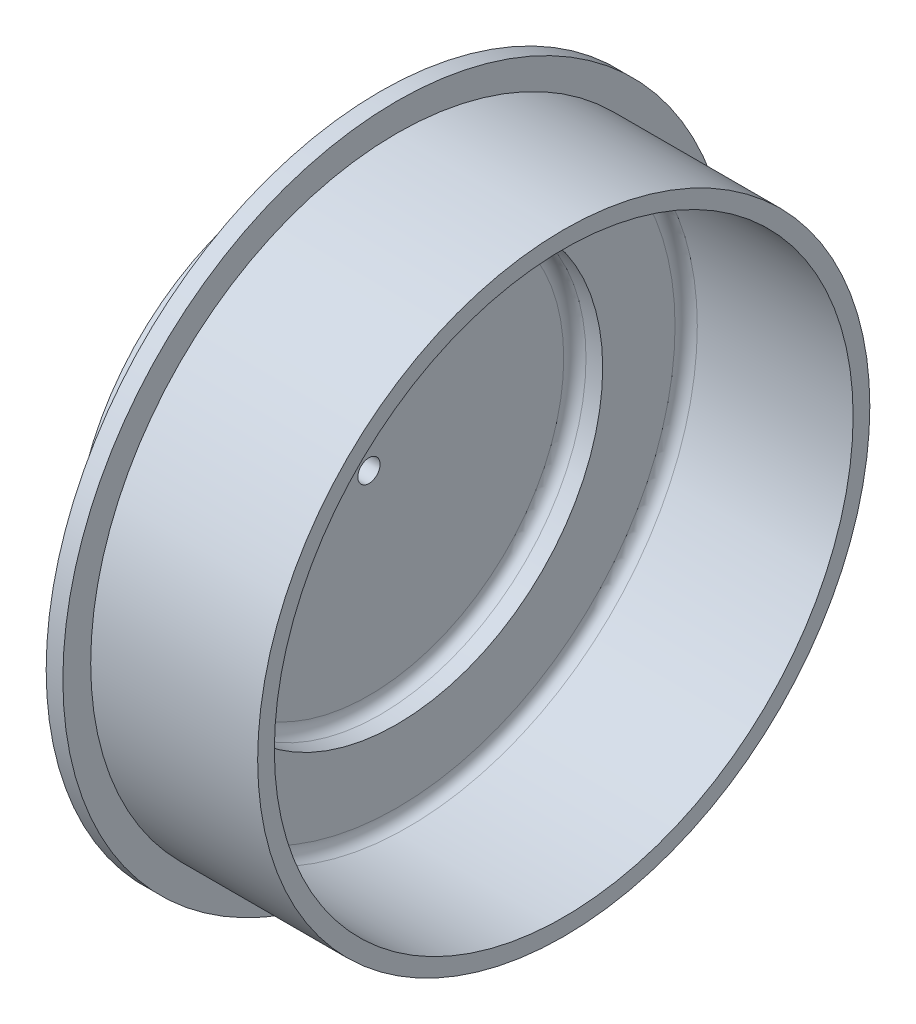
ISO-10303-21;
HEADER;
FILE_DESCRIPTION(('STEP AP214'),'2;1');
FILE_NAME('part.step','',(''),(''),'','','');
FILE_SCHEMA(('AUTOMOTIVE_DESIGN { 1 0 10303 214 1 1 1 1 }'));
ENDSEC;
DATA;
#1=APPLICATION_CONTEXT('core data for automotive mechanical design processes');
#2=APPLICATION_PROTOCOL_DEFINITION('international standard','automotive_design',2000,#1);
#3=PRODUCT_CONTEXT('',#1,'mechanical');
#4=PRODUCT('Part','Part','',(#3));
#5=PRODUCT_RELATED_PRODUCT_CATEGORY('part','',(#4));
#6=PRODUCT_DEFINITION_FORMATION('','',#4);
#7=PRODUCT_DEFINITION_CONTEXT('part definition',#1,'design');
#8=PRODUCT_DEFINITION('design','',#6,#7);
#9=PRODUCT_DEFINITION_SHAPE('','',#8);
#10=(LENGTH_UNIT() NAMED_UNIT(*) SI_UNIT(.MILLI.,.METRE.));
#11=(NAMED_UNIT(*) PLANE_ANGLE_UNIT() SI_UNIT($,.RADIAN.));
#12=(NAMED_UNIT(*) SI_UNIT($,.STERADIAN.) SOLID_ANGLE_UNIT());
#13=UNCERTAINTY_MEASURE_WITH_UNIT(LENGTH_MEASURE(1.E-05),#10,'distance_accuracy_value','');
#14=(GEOMETRIC_REPRESENTATION_CONTEXT(3) GLOBAL_UNCERTAINTY_ASSIGNED_CONTEXT((#13)) GLOBAL_UNIT_ASSIGNED_CONTEXT((#10,
#11,#12)) REPRESENTATION_CONTEXT('',''));
#15=CARTESIAN_POINT('',(0.,0.,0.));
#16=DIRECTION('',(0.,0.,1.));
#17=DIRECTION('',(1.,0.,0.));
#18=AXIS2_PLACEMENT_3D('',#15,#16,#17);
#19=CARTESIAN_POINT('',(0.,0.,0.));
#20=DIRECTION('',(-1.,0.,0.));
#21=DIRECTION('',(0.,0.,1.));
#22=AXIS2_PLACEMENT_3D('',#19,#20,#21);
#23=CYLINDRICAL_SURFACE('',#22,40.);
#24=CARTESIAN_POINT('',(0.,0.,0.));
#25=DIRECTION('',(-1.,0.,0.));
#26=DIRECTION('',(0.,0.,1.));
#27=AXIS2_PLACEMENT_3D('',#24,#25,#26);
#28=CIRCLE('',#27,40.);
#29=CARTESIAN_POINT('',(0.,0.,40.));
#30=VERTEX_POINT('',#29);
#31=EDGE_CURVE('E10',#30,#30,#28,.T.);
#32=ORIENTED_EDGE('',*,*,#31,.F.);
#33=EDGE_LOOP('',(#32));
#34=FACE_BOUND('',#33,.T.);
#35=CARTESIAN_POINT('',(15.,0.,0.));
#36=DIRECTION('',(-1.,0.,0.));
#37=DIRECTION('',(0.,0.,1.));
#38=AXIS2_PLACEMENT_3D('',#35,#36,#37);
#39=CIRCLE('',#38,40.);
#40=CARTESIAN_POINT('',(15.,0.,40.));
#41=VERTEX_POINT('',#40);
#42=EDGE_CURVE('E108',#41,#41,#39,.T.);
#43=ORIENTED_EDGE('',*,*,#42,.T.);
#44=EDGE_LOOP('',(#43));
#45=FACE_BOUND('',#44,.T.);
#46=ADVANCED_FACE('F37',(#34,#45),#23,.T.);
#47=CARTESIAN_POINT('',(0.,40.,0.));
#48=DIRECTION('',(1.,0.,0.));
#49=DIRECTION('',(0.,0.,-1.));
#50=AXIS2_PLACEMENT_3D('',#47,#48,#49);
#51=PLANE('',#50);
#52=CARTESIAN_POINT('',(0.,0.,0.));
#53=DIRECTION('',(-1.,0.,0.));
#54=DIRECTION('',(0.,0.,1.));
#55=AXIS2_PLACEMENT_3D('',#52,#53,#54);
#56=CIRCLE('',#55,37.);
#57=CARTESIAN_POINT('',(0.,0.,37.));
#58=VERTEX_POINT('',#57);
#59=EDGE_CURVE('E44',#58,#58,#56,.T.);
#60=ORIENTED_EDGE('',*,*,#59,.F.);
#61=EDGE_LOOP('',(#60));
#62=FACE_BOUND('',#61,.T.);
#63=ORIENTED_EDGE('',*,*,#31,.T.);
#64=EDGE_LOOP('',(#63));
#65=FACE_BOUND('',#64,.T.);
#66=ADVANCED_FACE('F200',(#62,#65),#51,.F.);
#67=CARTESIAN_POINT('',(0.,0.,0.));
#68=DIRECTION('',(-1.,0.,0.));
#69=DIRECTION('',(0.,0.,1.));
#70=AXIS2_PLACEMENT_3D('',#67,#68,#69);
#71=CYLINDRICAL_SURFACE('',#70,37.);
#72=CARTESIAN_POINT('',(8.,0.,0.));
#73=DIRECTION('',(-1.,0.,0.));
#74=DIRECTION('',(0.,0.,1.));
#75=AXIS2_PLACEMENT_3D('',#72,#73,#74);
#76=CIRCLE('',#75,37.);
#77=CARTESIAN_POINT('',(8.,0.,37.));
#78=VERTEX_POINT('',#77);
#79=EDGE_CURVE('E49',#78,#78,#76,.T.);
#80=ORIENTED_EDGE('',*,*,#79,.F.);
#81=EDGE_LOOP('',(#80));
#82=FACE_BOUND('',#81,.T.);
#83=ORIENTED_EDGE('',*,*,#59,.T.);
#84=EDGE_LOOP('',(#83));
#85=FACE_BOUND('',#84,.T.);
#86=ADVANCED_FACE('F195',(#82,#85),#71,.F.);
#87=CARTESIAN_POINT('',(8.,0.,0.));
#88=DIRECTION('',(-1.,0.,0.));
#89=DIRECTION('',(0.,0.,1.));
#90=AXIS2_PLACEMENT_3D('',#87,#88,#89);
#91=TOROIDAL_SURFACE('',#90,35.,2.);
#92=CARTESIAN_POINT('',(10.,0.,0.));
#93=DIRECTION('',(-1.,0.,0.));
#94=DIRECTION('',(0.,0.,1.));
#95=AXIS2_PLACEMENT_3D('',#92,#93,#94);
#96=CIRCLE('',#95,35.);
#97=CARTESIAN_POINT('',(10.,0.,35.));
#98=VERTEX_POINT('',#97);
#99=EDGE_CURVE('E54',#98,#98,#96,.T.);
#100=ORIENTED_EDGE('',*,*,#99,.F.);
#101=EDGE_LOOP('',(#100));
#102=FACE_BOUND('',#101,.T.);
#103=ORIENTED_EDGE('',*,*,#79,.T.);
#104=EDGE_LOOP('',(#103));
#105=FACE_BOUND('',#104,.T.);
#106=ADVANCED_FACE('F189',(#102,#105),#91,.F.);
#107=CARTESIAN_POINT('',(10.,35.,0.));
#108=DIRECTION('',(1.,0.,0.));
#109=DIRECTION('',(0.,0.,-1.));
#110=AXIS2_PLACEMENT_3D('',#107,#108,#109);
#111=PLANE('',#110);
#112=CARTESIAN_POINT('',(10.,0.,0.));
#113=DIRECTION('',(-1.,0.,0.));
#114=DIRECTION('',(0.,0.,1.));
#115=AXIS2_PLACEMENT_3D('',#112,#113,#114);
#116=CIRCLE('',#115,2.);
#117=CARTESIAN_POINT('',(10.,0.,2.));
#118=VERTEX_POINT('',#117);
#119=EDGE_CURVE('E60',#118,#118,#116,.T.);
#120=ORIENTED_EDGE('',*,*,#119,.F.);
#121=EDGE_LOOP('',(#120));
#122=FACE_BOUND('',#121,.T.);
#123=ORIENTED_EDGE('',*,*,#99,.T.);
#124=EDGE_LOOP('',(#123));
#125=FACE_BOUND('',#124,.T.);
#126=ADVANCED_FACE('F183',(#122,#125),#111,.F.);
#127=CARTESIAN_POINT('',(0.,0.,0.));
#128=DIRECTION('',(-1.,0.,0.));
#129=DIRECTION('',(0.,0.,1.));
#130=AXIS2_PLACEMENT_3D('',#127,#128,#129);
#131=CYLINDRICAL_SURFACE('',#130,2.);
#132=CARTESIAN_POINT('',(13.,0.,0.));
#133=DIRECTION('',(-1.,0.,0.));
#134=DIRECTION('',(0.,0.,1.));
#135=AXIS2_PLACEMENT_3D('',#132,#133,#134);
#136=CIRCLE('',#135,2.);
#137=CARTESIAN_POINT('',(13.,0.,2.));
#138=VERTEX_POINT('',#137);
#139=EDGE_CURVE('E64',#138,#138,#136,.T.);
#140=ORIENTED_EDGE('',*,*,#139,.F.);
#141=EDGE_LOOP('',(#140));
#142=FACE_BOUND('',#141,.T.);
#143=ORIENTED_EDGE('',*,*,#119,.T.);
#144=EDGE_LOOP('',(#143));
#145=FACE_BOUND('',#144,.T.);
#146=ADVANCED_FACE('F177',(#142,#145),#131,.F.);
#147=CARTESIAN_POINT('',(13.,2.,0.));
#148=DIRECTION('',(-1.,0.,0.));
#149=DIRECTION('',(0.,0.,1.));
#150=AXIS2_PLACEMENT_3D('',#147,#148,#149);
#151=PLANE('',#150);
#152=CARTESIAN_POINT('',(13.,0.,0.));
#153=DIRECTION('',(-1.,0.,0.));
#154=DIRECTION('',(0.,0.,1.));
#155=AXIS2_PLACEMENT_3D('',#152,#153,#154);
#156=CIRCLE('',#155,35.);
#157=CARTESIAN_POINT('',(13.,0.,35.));
#158=VERTEX_POINT('',#157);
#159=EDGE_CURVE('E68',#158,#158,#156,.T.);
#160=ORIENTED_EDGE('',*,*,#159,.F.);
#161=EDGE_LOOP('',(#160));
#162=FACE_BOUND('',#161,.T.);
#163=ORIENTED_EDGE('',*,*,#139,.T.);
#164=EDGE_LOOP('',(#163));
#165=FACE_BOUND('',#164,.T.);
#166=ADVANCED_FACE('F171',(#162,#165),#151,.F.);
#167=CARTESIAN_POINT('',(15.,0.,0.));
#168=DIRECTION('',(-1.,0.,0.));
#169=DIRECTION('',(0.,0.,1.));
#170=AXIS2_PLACEMENT_3D('',#167,#168,#169);
#171=TOROIDAL_SURFACE('',#170,35.,2.);
#172=CARTESIAN_POINT('',(15.,0.,0.));
#173=DIRECTION('',(-1.,0.,0.));
#174=DIRECTION('',(0.,0.,1.));
#175=AXIS2_PLACEMENT_3D('',#172,#173,#174);
#176=CIRCLE('',#175,37.);
#177=CARTESIAN_POINT('',(15.,0.,37.));
#178=VERTEX_POINT('',#177);
#179=EDGE_CURVE('E72',#178,#178,#176,.T.);
#180=ORIENTED_EDGE('',*,*,#179,.F.);
#181=EDGE_LOOP('',(#180));
#182=FACE_BOUND('',#181,.T.);
#183=ORIENTED_EDGE('',*,*,#159,.T.);
#184=EDGE_LOOP('',(#183));
#185=FACE_BOUND('',#184,.T.);
#186=ADVANCED_FACE('F165',(#182,#185),#171,.F.);
#187=CARTESIAN_POINT('',(0.,0.,0.));
#188=DIRECTION('',(-1.,0.,0.));
#189=DIRECTION('',(0.,0.,1.));
#190=AXIS2_PLACEMENT_3D('',#187,#188,#189);
#191=CYLINDRICAL_SURFACE('',#190,37.);
#192=CARTESIAN_POINT('',(18.,0.,0.));
#193=DIRECTION('',(-1.,0.,0.));
#194=DIRECTION('',(0.,0.,1.));
#195=AXIS2_PLACEMENT_3D('',#192,#193,#194);
#196=CIRCLE('',#195,37.);
#197=CARTESIAN_POINT('',(18.,0.,37.));
#198=VERTEX_POINT('',#197);
#199=EDGE_CURVE('E76',#198,#198,#196,.T.);
#200=ORIENTED_EDGE('',*,*,#199,.F.);
#201=EDGE_LOOP('',(#200));
#202=FACE_BOUND('',#201,.T.);
#203=ORIENTED_EDGE('',*,*,#179,.T.);
#204=EDGE_LOOP('',(#203));
#205=FACE_BOUND('',#204,.T.);
#206=ADVANCED_FACE('F159',(#202,#205),#191,.F.);
#207=CARTESIAN_POINT('',(18.,37.,0.));
#208=DIRECTION('',(-1.,0.,0.));
#209=DIRECTION('',(0.,0.,1.));
#210=AXIS2_PLACEMENT_3D('',#207,#208,#209);
#211=PLANE('',#210);
#212=CARTESIAN_POINT('',(18.,0.,0.));
#213=DIRECTION('',(-1.,0.,0.));
#214=DIRECTION('',(0.,0.,1.));
#215=AXIS2_PLACEMENT_3D('',#212,#213,#214);
#216=CIRCLE('',#215,50.);
#217=CARTESIAN_POINT('',(18.,0.,50.));
#218=VERTEX_POINT('',#217);
#219=EDGE_CURVE('E80',#218,#218,#216,.T.);
#220=ORIENTED_EDGE('',*,*,#219,.F.);
#221=EDGE_LOOP('',(#220));
#222=FACE_BOUND('',#221,.T.);
#223=ORIENTED_EDGE('',*,*,#199,.T.);
#224=EDGE_LOOP('',(#223));
#225=FACE_BOUND('',#224,.T.);
#226=ADVANCED_FACE('F153',(#222,#225),#211,.F.);
#227=CARTESIAN_POINT('',(20.,0.,0.));
#228=DIRECTION('',(-1.,0.,0.));
#229=DIRECTION('',(0.,0.,1.));
#230=AXIS2_PLACEMENT_3D('',#227,#228,#229);
#231=TOROIDAL_SURFACE('',#230,50.,2.);
#232=CARTESIAN_POINT('',(20.,0.,0.));
#233=DIRECTION('',(-1.,0.,0.));
#234=DIRECTION('',(0.,0.,1.));
#235=AXIS2_PLACEMENT_3D('',#232,#233,#234);
#236=CIRCLE('',#235,52.);
#237=CARTESIAN_POINT('',(20.,0.,52.));
#238=VERTEX_POINT('',#237);
#239=EDGE_CURVE('E84',#238,#238,#236,.T.);
#240=ORIENTED_EDGE('',*,*,#239,.F.);
#241=EDGE_LOOP('',(#240));
#242=FACE_BOUND('',#241,.T.);
#243=ORIENTED_EDGE('',*,*,#219,.T.);
#244=EDGE_LOOP('',(#243));
#245=FACE_BOUND('',#244,.T.);
#246=ADVANCED_FACE('F147',(#242,#245),#231,.F.);
#247=CARTESIAN_POINT('',(0.,0.,0.));
#248=DIRECTION('',(-1.,0.,0.));
#249=DIRECTION('',(0.,0.,1.));
#250=AXIS2_PLACEMENT_3D('',#247,#248,#249);
#251=CYLINDRICAL_SURFACE('',#250,52.);
#252=CARTESIAN_POINT('',(48.,0.,0.));
#253=DIRECTION('',(-1.,0.,0.));
#254=DIRECTION('',(0.,0.,1.));
#255=AXIS2_PLACEMENT_3D('',#252,#253,#254);
#256=CIRCLE('',#255,52.);
#257=CARTESIAN_POINT('',(48.,0.,52.));
#258=VERTEX_POINT('',#257);
#259=EDGE_CURVE('E88',#258,#258,#256,.T.);
#260=ORIENTED_EDGE('',*,*,#259,.F.);
#261=EDGE_LOOP('',(#260));
#262=FACE_BOUND('',#261,.T.);
#263=ORIENTED_EDGE('',*,*,#239,.T.);
#264=EDGE_LOOP('',(#263));
#265=FACE_BOUND('',#264,.T.);
#266=ADVANCED_FACE('F141',(#262,#265),#251,.F.);
#267=CARTESIAN_POINT('',(48.,52.,0.));
#268=DIRECTION('',(-1.,0.,0.));
#269=DIRECTION('',(0.,0.,1.));
#270=AXIS2_PLACEMENT_3D('',#267,#268,#269);
#271=PLANE('',#270);
#272=CARTESIAN_POINT('',(48.,0.,0.));
#273=DIRECTION('',(-1.,0.,0.));
#274=DIRECTION('',(0.,0.,1.));
#275=AXIS2_PLACEMENT_3D('',#272,#273,#274);
#276=CIRCLE('',#275,55.);
#277=CARTESIAN_POINT('',(48.,0.,55.));
#278=VERTEX_POINT('',#277);
#279=EDGE_CURVE('E92',#278,#278,#276,.T.);
#280=ORIENTED_EDGE('',*,*,#279,.F.);
#281=EDGE_LOOP('',(#280));
#282=FACE_BOUND('',#281,.T.);
#283=ORIENTED_EDGE('',*,*,#259,.T.);
#284=EDGE_LOOP('',(#283));
#285=FACE_BOUND('',#284,.T.);
#286=ADVANCED_FACE('F135',(#282,#285),#271,.F.);
#287=CARTESIAN_POINT('',(0.,0.,0.));
#288=DIRECTION('',(-1.,0.,0.));
#289=DIRECTION('',(0.,0.,1.));
#290=AXIS2_PLACEMENT_3D('',#287,#288,#289);
#291=CYLINDRICAL_SURFACE('',#290,55.);
#292=CARTESIAN_POINT('',(18.,0.,0.));
#293=DIRECTION('',(-1.,0.,0.));
#294=DIRECTION('',(0.,0.,1.));
#295=AXIS2_PLACEMENT_3D('',#292,#293,#294);
#296=CIRCLE('',#295,55.);
#297=CARTESIAN_POINT('',(18.,0.,55.));
#298=VERTEX_POINT('',#297);
#299=EDGE_CURVE('E96',#298,#298,#296,.T.);
#300=ORIENTED_EDGE('',*,*,#299,.F.);
#301=EDGE_LOOP('',(#300));
#302=FACE_BOUND('',#301,.T.);
#303=ORIENTED_EDGE('',*,*,#279,.T.);
#304=EDGE_LOOP('',(#303));
#305=FACE_BOUND('',#304,.T.);
#306=ADVANCED_FACE('F129',(#302,#305),#291,.T.);
#307=CARTESIAN_POINT('',(18.,55.,0.));
#308=DIRECTION('',(-1.,0.,0.));
#309=DIRECTION('',(0.,0.,1.));
#310=AXIS2_PLACEMENT_3D('',#307,#308,#309);
#311=PLANE('',#310);
#312=CARTESIAN_POINT('',(18.,0.,0.));
#313=DIRECTION('',(-1.,0.,0.));
#314=DIRECTION('',(0.,0.,1.));
#315=AXIS2_PLACEMENT_3D('',#312,#313,#314);
#316=CIRCLE('',#315,60.);
#317=CARTESIAN_POINT('',(18.,0.,60.));
#318=VERTEX_POINT('',#317);
#319=EDGE_CURVE('E100',#318,#318,#316,.T.);
#320=ORIENTED_EDGE('',*,*,#319,.F.);
#321=EDGE_LOOP('',(#320));
#322=FACE_BOUND('',#321,.T.);
#323=ORIENTED_EDGE('',*,*,#299,.T.);
#324=EDGE_LOOP('',(#323));
#325=FACE_BOUND('',#324,.T.);
#326=ADVANCED_FACE('F123',(#322,#325),#311,.F.);
#327=CARTESIAN_POINT('',(0.,0.,0.));
#328=DIRECTION('',(-1.,0.,0.));
#329=DIRECTION('',(0.,0.,1.));
#330=AXIS2_PLACEMENT_3D('',#327,#328,#329);
#331=CYLINDRICAL_SURFACE('',#330,60.);
#332=CARTESIAN_POINT('',(15.,0.,0.));
#333=DIRECTION('',(-1.,0.,0.));
#334=DIRECTION('',(0.,0.,1.));
#335=AXIS2_PLACEMENT_3D('',#332,#333,#334);
#336=CIRCLE('',#335,60.);
#337=CARTESIAN_POINT('',(15.,0.,60.));
#338=VERTEX_POINT('',#337);
#339=EDGE_CURVE('E104',#338,#338,#336,.T.);
#340=ORIENTED_EDGE('',*,*,#339,.F.);
#341=EDGE_LOOP('',(#340));
#342=FACE_BOUND('',#341,.T.);
#343=ORIENTED_EDGE('',*,*,#319,.T.);
#344=EDGE_LOOP('',(#343));
#345=FACE_BOUND('',#344,.T.);
#346=ADVANCED_FACE('F117',(#342,#345),#331,.T.);
#347=CARTESIAN_POINT('',(15.,52.,0.));
#348=DIRECTION('',(1.,0.,0.));
#349=DIRECTION('',(0.,0.,-1.));
#350=AXIS2_PLACEMENT_3D('',#347,#348,#349);
#351=PLANE('',#350);
#352=ORIENTED_EDGE('',*,*,#42,.F.);
#353=EDGE_LOOP('',(#352));
#354=FACE_BOUND('',#353,.T.);
#355=ORIENTED_EDGE('',*,*,#339,.T.);
#356=EDGE_LOOP('',(#355));
#357=FACE_BOUND('',#356,.T.);
#358=ADVANCED_FACE('F114',(#354,#357),#351,.F.);
#359=CLOSED_SHELL('',(#46,#66,#86,#106,#126,#146,#166,#186,#206,#226,#246,#266,#286,#306,#326,
#346,#358));
#360=MANIFOLD_SOLID_BREP('B2',#359);
#361=ADVANCED_BREP_SHAPE_REPRESENTATION('',(#18,#360),#14);
#362=SHAPE_DEFINITION_REPRESENTATION(#9,#361);
ENDSEC;
END-ISO-10303-21;
